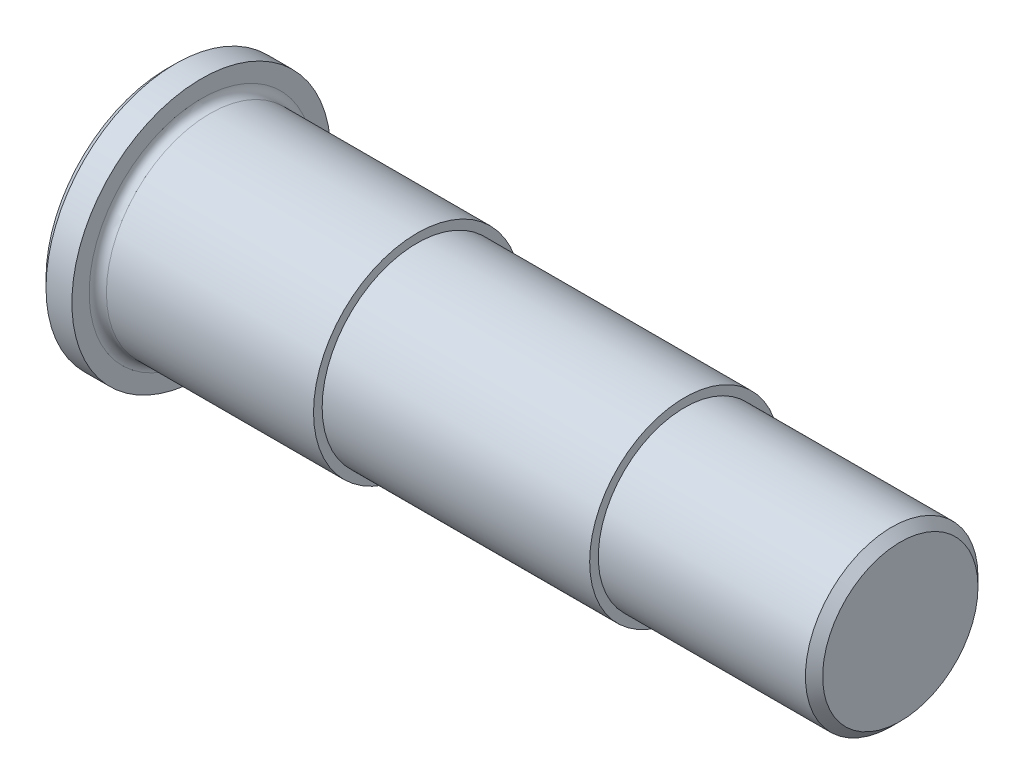
ISO-10303-21;
HEADER;
FILE_DESCRIPTION(('STEP AP214'),'2;1');
FILE_NAME('part.step','',(''),(''),'','','');
FILE_SCHEMA(('AUTOMOTIVE_DESIGN { 1 0 10303 214 1 1 1 1 }'));
ENDSEC;
DATA;
#1=APPLICATION_CONTEXT('core data for automotive mechanical design processes');
#2=APPLICATION_PROTOCOL_DEFINITION('international standard','automotive_design',2000,#1);
#3=PRODUCT_CONTEXT('',#1,'mechanical');
#4=PRODUCT('Part','Part','',(#3));
#5=PRODUCT_RELATED_PRODUCT_CATEGORY('part','',(#4));
#6=PRODUCT_DEFINITION_FORMATION('','',#4);
#7=PRODUCT_DEFINITION_CONTEXT('part definition',#1,'design');
#8=PRODUCT_DEFINITION('design','',#6,#7);
#9=PRODUCT_DEFINITION_SHAPE('','',#8);
#10=(LENGTH_UNIT() NAMED_UNIT(*) SI_UNIT(.MILLI.,.METRE.));
#11=(NAMED_UNIT(*) PLANE_ANGLE_UNIT() SI_UNIT($,.RADIAN.));
#12=(NAMED_UNIT(*) SI_UNIT($,.STERADIAN.) SOLID_ANGLE_UNIT());
#13=UNCERTAINTY_MEASURE_WITH_UNIT(LENGTH_MEASURE(1.E-05),#10,'distance_accuracy_value','');
#14=(GEOMETRIC_REPRESENTATION_CONTEXT(3) GLOBAL_UNCERTAINTY_ASSIGNED_CONTEXT((#13)) GLOBAL_UNIT_ASSIGNED_CONTEXT((#10,
#11,#12)) REPRESENTATION_CONTEXT('',''));
#15=CARTESIAN_POINT('',(0.,0.,0.));
#16=DIRECTION('',(0.,0.,1.));
#17=DIRECTION('',(1.,0.,0.));
#18=AXIS2_PLACEMENT_3D('',#15,#16,#17);
#19=CARTESIAN_POINT('',(85.,0.,0.));
#20=DIRECTION('',(-1.,0.,0.));
#21=DIRECTION('',(0.,0.,1.));
#22=AXIS2_PLACEMENT_3D('',#19,#20,#21);
#23=CYLINDRICAL_SURFACE('',#22,10.);
#24=CARTESIAN_POINT('',(83.9999999999996,0.,0.));
#25=DIRECTION('',(1.,0.,0.));
#26=DIRECTION('',(0.,0.,-1.));
#27=AXIS2_PLACEMENT_3D('',#24,#25,#26);
#28=CIRCLE('',#27,10.);
#29=CARTESIAN_POINT('',(83.9999999999996,0.,-10.));
#30=VERTEX_POINT('',#29);
#31=EDGE_CURVE('E99',#30,#30,#28,.F.);
#32=ORIENTED_EDGE('',*,*,#31,.T.);
#33=EDGE_LOOP('',(#32));
#34=FACE_BOUND('',#33,.T.);
#35=CARTESIAN_POINT('',(60.0000000000001,0.,0.));
#36=DIRECTION('',(1.,0.,0.));
#37=DIRECTION('',(0.,0.,-1.));
#38=AXIS2_PLACEMENT_3D('',#35,#36,#37);
#39=CIRCLE('',#38,10.);
#40=CARTESIAN_POINT('',(60.0000000000001,0.,-10.));
#41=VERTEX_POINT('',#40);
#42=EDGE_CURVE('E71',#41,#41,#39,.T.);
#43=ORIENTED_EDGE('',*,*,#42,.T.);
#44=EDGE_LOOP('',(#43));
#45=FACE_BOUND('',#44,.T.);
#46=CARTESIAN_POINT('',(83.0000000000001,0.,0.));
#47=DIRECTION('',(-1.,0.,0.));
#48=DIRECTION('',(0.,0.,1.));
#49=AXIS2_PLACEMENT_3D('',#46,#47,#48);
#50=CIRCLE('',#49,10.);
#51=CARTESIAN_POINT('',(83.0000000000001,7.14142842854299,-6.99999999999985));
#52=VERTEX_POINT('',#51);
#53=CARTESIAN_POINT('',(83.0000000000001,-7.14142842854299,-6.99999999999985));
#54=VERTEX_POINT('',#53);
#55=EDGE_CURVE('E68',#52,#54,#50,.T.);
#56=ORIENTED_EDGE('',*,*,#55,.F.);
#57=DIRECTION('',(-1.,0.,0.));
#58=VECTOR('',#57,1.);
#59=CARTESIAN_POINT('',(83.0000000000001,7.14142842854299,-6.99999999999985));
#60=LINE('',#59,#58);
#61=CARTESIAN_POINT('',(80.0000000000001,7.14142842854299,-6.99999999999985));
#62=VERTEX_POINT('',#61);
#63=EDGE_CURVE('E55',#52,#62,#60,.T.);
#64=ORIENTED_EDGE('',*,*,#63,.T.);
#65=CARTESIAN_POINT('',(80.0000000000001,0.,0.));
#66=DIRECTION('',(-1.,0.,0.));
#67=DIRECTION('',(0.,0.,1.));
#68=AXIS2_PLACEMENT_3D('',#65,#66,#67);
#69=CIRCLE('',#68,10.);
#70=CARTESIAN_POINT('',(80.0000000000001,-7.14142842854299,-6.99999999999986));
#71=VERTEX_POINT('',#70);
#72=EDGE_CURVE('E61',#62,#71,#69,.T.);
#73=ORIENTED_EDGE('',*,*,#72,.T.);
#74=DIRECTION('',(-1.,0.,0.));
#75=VECTOR('',#74,1.);
#76=CARTESIAN_POINT('',(83.0000000000001,-7.14142842854299,-6.99999999999985));
#77=LINE('',#76,#75);
#78=EDGE_CURVE('E67',#54,#71,#77,.T.);
#79=ORIENTED_EDGE('',*,*,#78,.F.);
#80=EDGE_LOOP('',(#56,#64,#73,#79));
#81=FACE_BOUND('',#80,.T.);
#82=ADVANCED_FACE('F33',(#34,#45,#81),#23,.T.);
#83=CARTESIAN_POINT('',(0.,0.,0.));
#84=DIRECTION('',(1.,0.,0.));
#85=DIRECTION('',(0.,0.,-1.));
#86=AXIS2_PLACEMENT_3D('',#83,#84,#85);
#87=CYLINDRICAL_SURFACE('',#86,15.);
#88=CARTESIAN_POINT('',(1.00000000000041,0.,0.));
#89=DIRECTION('',(-1.,0.,0.));
#90=DIRECTION('',(0.,0.,1.));
#91=AXIS2_PLACEMENT_3D('',#88,#89,#90);
#92=CIRCLE('',#91,15.);
#93=CARTESIAN_POINT('',(1.00000000000041,0.,15.));
#94=VERTEX_POINT('',#93);
#95=EDGE_CURVE('E90',#94,#94,#92,.F.);
#96=ORIENTED_EDGE('',*,*,#95,.T.);
#97=EDGE_LOOP('',(#96));
#98=FACE_BOUND('',#97,.T.);
#99=CARTESIAN_POINT('',(4.00000000000006,0.,0.));
#100=DIRECTION('',(1.,0.,0.));
#101=DIRECTION('',(0.,0.,-1.));
#102=AXIS2_PLACEMENT_3D('',#99,#100,#101);
#103=CIRCLE('',#102,15.);
#104=CARTESIAN_POINT('',(4.00000000000006,0.,-15.));
#105=VERTEX_POINT('',#104);
#106=EDGE_CURVE('E87',#105,#105,#103,.T.);
#107=ORIENTED_EDGE('',*,*,#106,.F.);
#108=EDGE_LOOP('',(#107));
#109=FACE_BOUND('',#108,.T.);
#110=ADVANCED_FACE('F117',(#98,#109),#87,.T.);
#111=CARTESIAN_POINT('',(0.,15.,0.));
#112=DIRECTION('',(-1.,0.,0.));
#113=DIRECTION('',(0.,0.,1.));
#114=AXIS2_PLACEMENT_3D('',#111,#112,#113);
#115=PLANE('',#114);
#116=CARTESIAN_POINT('',(0.,0.,0.));
#117=DIRECTION('',(-1.,0.,0.));
#118=DIRECTION('',(0.,0.,1.));
#119=AXIS2_PLACEMENT_3D('',#116,#117,#118);
#120=CIRCLE('',#119,13.9999999999996);
#121=CARTESIAN_POINT('',(0.,0.,13.9999999999996));
#122=VERTEX_POINT('',#121);
#123=EDGE_CURVE('E93',#122,#122,#120,.T.);
#124=ORIENTED_EDGE('',*,*,#123,.T.);
#125=EDGE_LOOP('',(#124));
#126=FACE_BOUND('',#125,.T.);
#127=ADVANCED_FACE('F123',(#126),#115,.T.);
#128=CARTESIAN_POINT('',(4.00000000000006,0.,0.));
#129=DIRECTION('',(1.,0.,0.));
#130=DIRECTION('',(0.,0.,-1.));
#131=AXIS2_PLACEMENT_3D('',#128,#129,#130);
#132=PLANE('',#131);
#133=CARTESIAN_POINT('',(4.00000000000006,0.,0.));
#134=DIRECTION('',(1.,0.,0.));
#135=DIRECTION('',(0.,0.,-1.));
#136=AXIS2_PLACEMENT_3D('',#133,#134,#135);
#137=CIRCLE('',#136,13.);
#138=CARTESIAN_POINT('',(4.00000000000006,0.,-13.));
#139=VERTEX_POINT('',#138);
#140=EDGE_CURVE('E11',#139,#139,#137,.F.);
#141=ORIENTED_EDGE('',*,*,#140,.T.);
#142=EDGE_LOOP('',(#141));
#143=FACE_BOUND('',#142,.T.);
#144=ORIENTED_EDGE('',*,*,#106,.T.);
#145=EDGE_LOOP('',(#144));
#146=FACE_BOUND('',#145,.T.);
#147=ADVANCED_FACE('F145',(#143,#146),#132,.T.);
#148=CARTESIAN_POINT('',(29.0000000000001,0.,0.));
#149=DIRECTION('',(-1.,0.,0.));
#150=DIRECTION('',(0.,0.,1.));
#151=AXIS2_PLACEMENT_3D('',#148,#149,#150);
#152=CYLINDRICAL_SURFACE('',#151,12.);
#153=CARTESIAN_POINT('',(5.00000000000006,0.,0.));
#154=DIRECTION('',(1.,0.,0.));
#155=DIRECTION('',(0.,0.,-1.));
#156=AXIS2_PLACEMENT_3D('',#153,#154,#155);
#157=CIRCLE('',#156,12.);
#158=CARTESIAN_POINT('',(5.00000000000006,0.,-12.));
#159=VERTEX_POINT('',#158);
#160=EDGE_CURVE('E41',#159,#159,#157,.T.);
#161=ORIENTED_EDGE('',*,*,#160,.T.);
#162=EDGE_LOOP('',(#161));
#163=FACE_BOUND('',#162,.T.);
#164=CARTESIAN_POINT('',(29.0000000000001,0.,0.));
#165=DIRECTION('',(1.,0.,0.));
#166=DIRECTION('',(0.,0.,-1.));
#167=AXIS2_PLACEMENT_3D('',#164,#165,#166);
#168=CIRCLE('',#167,12.);
#169=CARTESIAN_POINT('',(29.0000000000001,0.,-12.));
#170=VERTEX_POINT('',#169);
#171=EDGE_CURVE('E82',#170,#170,#168,.T.);
#172=ORIENTED_EDGE('',*,*,#171,.F.);
#173=EDGE_LOOP('',(#172));
#174=FACE_BOUND('',#173,.T.);
#175=ADVANCED_FACE('F104',(#163,#174),#152,.T.);
#176=CARTESIAN_POINT('',(29.0000000000001,0.,0.));
#177=DIRECTION('',(1.,0.,0.));
#178=DIRECTION('',(0.,0.,-1.));
#179=AXIS2_PLACEMENT_3D('',#176,#177,#178);
#180=PLANE('',#179);
#181=CARTESIAN_POINT('',(29.0000000000001,0.,0.));
#182=DIRECTION('',(1.,0.,0.));
#183=DIRECTION('',(0.,0.,-1.));
#184=AXIS2_PLACEMENT_3D('',#181,#182,#183);
#185=CIRCLE('',#184,11.);
#186=CARTESIAN_POINT('',(29.0000000000001,0.,-11.));
#187=VERTEX_POINT('',#186);
#188=EDGE_CURVE('E74',#187,#187,#185,.T.);
#189=ORIENTED_EDGE('',*,*,#188,.F.);
#190=EDGE_LOOP('',(#189));
#191=FACE_BOUND('',#190,.T.);
#192=ORIENTED_EDGE('',*,*,#171,.T.);
#193=EDGE_LOOP('',(#192));
#194=FACE_BOUND('',#193,.T.);
#195=ADVANCED_FACE('F138',(#191,#194),#180,.T.);
#196=CARTESIAN_POINT('',(60.0000000000001,0.,0.));
#197=DIRECTION('',(-1.,0.,0.));
#198=DIRECTION('',(0.,0.,1.));
#199=AXIS2_PLACEMENT_3D('',#196,#197,#198);
#200=CYLINDRICAL_SURFACE('',#199,11.);
#201=CARTESIAN_POINT('',(60.0000000000001,0.,0.));
#202=DIRECTION('',(1.,0.,0.));
#203=DIRECTION('',(0.,0.,-1.));
#204=AXIS2_PLACEMENT_3D('',#201,#202,#203);
#205=CIRCLE('',#204,11.);
#206=CARTESIAN_POINT('',(60.0000000000001,0.,-11.));
#207=VERTEX_POINT('',#206);
#208=EDGE_CURVE('E79',#207,#207,#205,.T.);
#209=ORIENTED_EDGE('',*,*,#208,.F.);
#210=EDGE_LOOP('',(#209));
#211=FACE_BOUND('',#210,.T.);
#212=ORIENTED_EDGE('',*,*,#188,.T.);
#213=EDGE_LOOP('',(#212));
#214=FACE_BOUND('',#213,.T.);
#215=ADVANCED_FACE('F134',(#211,#214),#200,.T.);
#216=CARTESIAN_POINT('',(60.0000000000001,0.,0.));
#217=DIRECTION('',(1.,0.,0.));
#218=DIRECTION('',(0.,0.,-1.));
#219=AXIS2_PLACEMENT_3D('',#216,#217,#218);
#220=PLANE('',#219);
#221=ORIENTED_EDGE('',*,*,#42,.F.);
#222=EDGE_LOOP('',(#221));
#223=FACE_BOUND('',#222,.T.);
#224=ORIENTED_EDGE('',*,*,#208,.T.);
#225=EDGE_LOOP('',(#224));
#226=FACE_BOUND('',#225,.T.);
#227=ADVANCED_FACE('F131',(#223,#226),#220,.T.);
#228=CARTESIAN_POINT('',(85.,0.,0.));
#229=DIRECTION('',(1.,0.,0.));
#230=DIRECTION('',(0.,0.,-1.));
#231=AXIS2_PLACEMENT_3D('',#228,#229,#230);
#232=PLANE('',#231);
#233=CARTESIAN_POINT('',(85.,0.,0.));
#234=DIRECTION('',(1.,0.,0.));
#235=DIRECTION('',(0.,0.,-1.));
#236=AXIS2_PLACEMENT_3D('',#233,#234,#235);
#237=CIRCLE('',#236,8.99999999999959);
#238=CARTESIAN_POINT('',(85.,0.,-8.99999999999959));
#239=VERTEX_POINT('',#238);
#240=EDGE_CURVE('E96',#239,#239,#237,.T.);
#241=ORIENTED_EDGE('',*,*,#240,.T.);
#242=EDGE_LOOP('',(#241));
#243=FACE_BOUND('',#242,.T.);
#244=ADVANCED_FACE('F129',(#243),#232,.T.);
#245=CARTESIAN_POINT('',(83.0000000000001,-7.14142842854299,-6.99999999999985));
#246=DIRECTION('',(0.,0.,1.));
#247=DIRECTION('',(1.,0.,0.));
#248=AXIS2_PLACEMENT_3D('',#245,#246,#247);
#249=PLANE('',#248);
#250=DIRECTION('',(0.,1.,0.));
#251=VECTOR('',#250,1.);
#252=CARTESIAN_POINT('',(80.0000000000001,-7.14142842854299,-6.99999999999986));
#253=LINE('',#252,#251);
#254=EDGE_CURVE('E47',#71,#62,#253,.T.);
#255=ORIENTED_EDGE('',*,*,#254,.T.);
#256=ORIENTED_EDGE('',*,*,#63,.F.);
#257=DIRECTION('',(0.,1.,0.));
#258=VECTOR('',#257,1.);
#259=CARTESIAN_POINT('',(83.0000000000001,-7.14142842854299,-6.99999999999985));
#260=LINE('',#259,#258);
#261=EDGE_CURVE('E76',#54,#52,#260,.T.);
#262=ORIENTED_EDGE('',*,*,#261,.F.);
#263=ORIENTED_EDGE('',*,*,#78,.T.);
#264=EDGE_LOOP('',(#255,#256,#262,#263));
#265=FACE_BOUND('',#264,.T.);
#266=ADVANCED_FACE('F66',(#265),#249,.F.);
#267=CARTESIAN_POINT('',(83.0000000000001,0.,0.));
#268=DIRECTION('',(-1.,0.,0.));
#269=DIRECTION('',(0.,0.,1.));
#270=AXIS2_PLACEMENT_3D('',#267,#268,#269);
#271=PLANE('',#270);
#272=ORIENTED_EDGE('',*,*,#55,.T.);
#273=ORIENTED_EDGE('',*,*,#261,.T.);
#274=EDGE_LOOP('',(#272,#273));
#275=FACE_BOUND('',#274,.T.);
#276=ADVANCED_FACE('F157',(#275),#271,.T.);
#277=CARTESIAN_POINT('',(80.0000000000001,0.,0.));
#278=DIRECTION('',(-1.,0.,0.));
#279=DIRECTION('',(0.,0.,1.));
#280=AXIS2_PLACEMENT_3D('',#277,#278,#279);
#281=PLANE('',#280);
#282=ORIENTED_EDGE('',*,*,#72,.F.);
#283=ORIENTED_EDGE('',*,*,#254,.F.);
#284=EDGE_LOOP('',(#282,#283));
#285=FACE_BOUND('',#284,.T.);
#286=ADVANCED_FACE('F62',(#285),#281,.F.);
#287=CARTESIAN_POINT('',(1.00000000000041,0.,0.));
#288=DIRECTION('',(1.,0.,0.));
#289=DIRECTION('',(0.,0.,-1.));
#290=AXIS2_PLACEMENT_3D('',#287,#288,#289);
#291=CONICAL_SURFACE('',#290,15.,0.785398163397454);
#292=ORIENTED_EDGE('',*,*,#123,.F.);
#293=EDGE_LOOP('',(#292));
#294=FACE_BOUND('',#293,.T.);
#295=ORIENTED_EDGE('',*,*,#95,.F.);
#296=EDGE_LOOP('',(#295));
#297=FACE_BOUND('',#296,.T.);
#298=ADVANCED_FACE('F113',(#294,#297),#291,.T.);
#299=CARTESIAN_POINT('',(85.,0.,0.));
#300=DIRECTION('',(-1.,0.,0.));
#301=DIRECTION('',(0.,0.,1.));
#302=AXIS2_PLACEMENT_3D('',#299,#300,#301);
#303=CONICAL_SURFACE('',#302,8.99999999999959,0.785398163397444);
#304=ORIENTED_EDGE('',*,*,#31,.F.);
#305=EDGE_LOOP('',(#304));
#306=FACE_BOUND('',#305,.T.);
#307=ORIENTED_EDGE('',*,*,#240,.F.);
#308=EDGE_LOOP('',(#307));
#309=FACE_BOUND('',#308,.T.);
#310=ADVANCED_FACE('F108',(#306,#309),#303,.T.);
#311=CARTESIAN_POINT('',(5.00000000000006,0.,0.));
#312=DIRECTION('',(1.,0.,0.));
#313=DIRECTION('',(0.,0.,-1.));
#314=AXIS2_PLACEMENT_3D('',#311,#312,#313);
#315=TOROIDAL_SURFACE('',#314,13.,1.);
#316=ORIENTED_EDGE('',*,*,#140,.F.);
#317=EDGE_LOOP('',(#316));
#318=FACE_BOUND('',#317,.T.);
#319=ORIENTED_EDGE('',*,*,#160,.F.);
#320=EDGE_LOOP('',(#319));
#321=FACE_BOUND('',#320,.T.);
#322=ADVANCED_FACE('F35',(#318,#321),#315,.F.);
#323=CLOSED_SHELL('',(#82,#110,#127,#147,#175,#195,#215,#227,#244,#266,#276,#286,#298,#310,#322));
#324=MANIFOLD_SOLID_BREP('B2',#323);
#325=ADVANCED_BREP_SHAPE_REPRESENTATION('',(#18,#324),#14);
#326=SHAPE_DEFINITION_REPRESENTATION(#9,#325);
ENDSEC;
END-ISO-10303-21;
